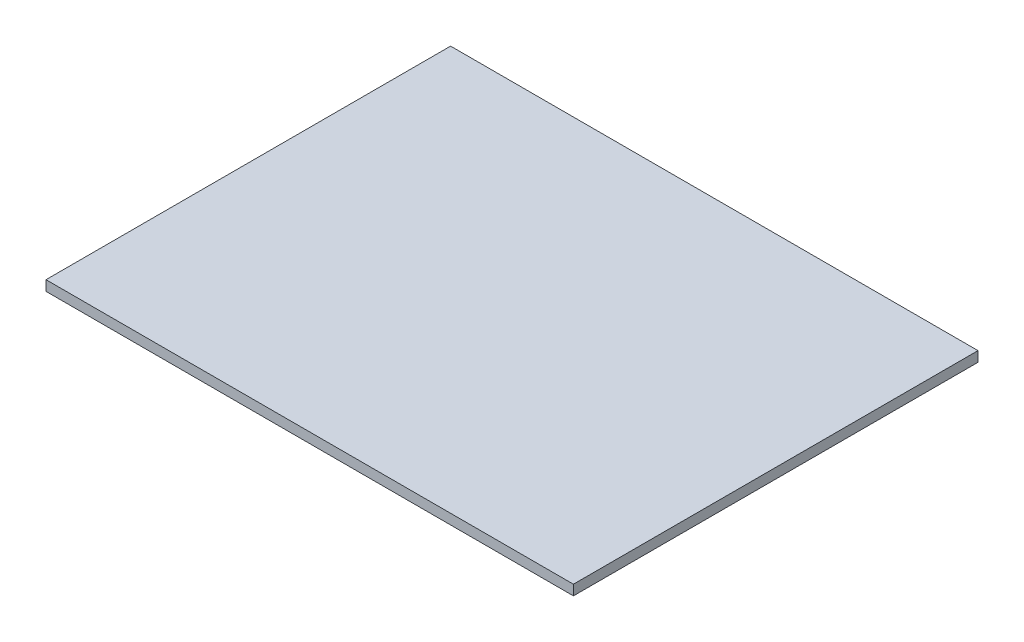
ISO-10303-21;
HEADER;
FILE_DESCRIPTION(('STEP AP214'),'2;1');
FILE_NAME('part.step','',(''),(''),'','','');
FILE_SCHEMA(('AUTOMOTIVE_DESIGN { 1 0 10303 214 1 1 1 1 }'));
ENDSEC;
DATA;
#1=APPLICATION_CONTEXT('core data for automotive mechanical design processes');
#2=APPLICATION_PROTOCOL_DEFINITION('international standard','automotive_design',2000,#1);
#3=PRODUCT_CONTEXT('',#1,'mechanical');
#4=PRODUCT('Part','Part','',(#3));
#5=PRODUCT_RELATED_PRODUCT_CATEGORY('part','',(#4));
#6=PRODUCT_DEFINITION_FORMATION('','',#4);
#7=PRODUCT_DEFINITION_CONTEXT('part definition',#1,'design');
#8=PRODUCT_DEFINITION('design','',#6,#7);
#9=PRODUCT_DEFINITION_SHAPE('','',#8);
#10=(LENGTH_UNIT() NAMED_UNIT(*) SI_UNIT(.MILLI.,.METRE.));
#11=(NAMED_UNIT(*) PLANE_ANGLE_UNIT() SI_UNIT($,.RADIAN.));
#12=(NAMED_UNIT(*) SI_UNIT($,.STERADIAN.) SOLID_ANGLE_UNIT());
#13=UNCERTAINTY_MEASURE_WITH_UNIT(LENGTH_MEASURE(1.E-05),#10,'distance_accuracy_value','');
#14=(GEOMETRIC_REPRESENTATION_CONTEXT(3) GLOBAL_UNCERTAINTY_ASSIGNED_CONTEXT((#13)) GLOBAL_UNIT_ASSIGNED_CONTEXT((#10,
#11,#12)) REPRESENTATION_CONTEXT('',''));
#15=CARTESIAN_POINT('',(0.,0.,0.));
#16=DIRECTION('',(0.,0.,1.));
#17=DIRECTION('',(1.,0.,0.));
#18=AXIS2_PLACEMENT_3D('',#15,#16,#17);
#19=CARTESIAN_POINT('',(-799.128065395095,18.,-494.779291553133));
#20=DIRECTION('',(1.,0.,0.));
#21=DIRECTION('',(0.,0.,-1.));
#22=AXIS2_PLACEMENT_3D('',#19,#20,#21);
#23=PLANE('',#22);
#24=DIRECTION('',(0.,0.,1.));
#25=VECTOR('',#24,1.);
#26=CARTESIAN_POINT('',(-799.128065395095,0.,-494.779291553133));
#27=LINE('',#26,#25);
#28=CARTESIAN_POINT('',(-799.128065395095,0.,-494.779291553133));
#29=VERTEX_POINT('',#28);
#30=CARTESIAN_POINT('',(-799.128065395095,0.,223.220708446867));
#31=VERTEX_POINT('',#30);
#32=EDGE_CURVE('E98',#29,#31,#27,.T.);
#33=ORIENTED_EDGE('',*,*,#32,.T.);
#34=DIRECTION('',(0.,-1.,0.));
#35=VECTOR('',#34,1.);
#36=CARTESIAN_POINT('',(-799.128065395095,18.,223.220708446867));
#37=LINE('',#36,#35);
#38=CARTESIAN_POINT('',(-799.128065395095,18.,223.220708446867));
#39=VERTEX_POINT('',#38);
#40=EDGE_CURVE('E11',#39,#31,#37,.T.);
#41=ORIENTED_EDGE('',*,*,#40,.F.);
#42=DIRECTION('',(0.,0.,1.));
#43=VECTOR('',#42,1.);
#44=CARTESIAN_POINT('',(-799.128065395095,18.,-494.779291553133));
#45=LINE('',#44,#43);
#46=CARTESIAN_POINT('',(-799.128065395095,18.,-494.779291553133));
#47=VERTEX_POINT('',#46);
#48=EDGE_CURVE('E86',#47,#39,#45,.T.);
#49=ORIENTED_EDGE('',*,*,#48,.F.);
#50=DIRECTION('',(0.,-1.,0.));
#51=VECTOR('',#50,1.);
#52=CARTESIAN_POINT('',(-799.128065395095,18.,-494.779291553133));
#53=LINE('',#52,#51);
#54=EDGE_CURVE('E94',#47,#29,#53,.T.);
#55=ORIENTED_EDGE('',*,*,#54,.T.);
#56=EDGE_LOOP('',(#33,#41,#49,#55));
#57=FACE_BOUND('',#56,.T.);
#58=ADVANCED_FACE('F35',(#57),#23,.F.);
#59=CARTESIAN_POINT('',(-799.128065395095,18.,223.220708446867));
#60=DIRECTION('',(0.,0.,-1.));
#61=DIRECTION('',(-1.,0.,0.));
#62=AXIS2_PLACEMENT_3D('',#59,#60,#61);
#63=PLANE('',#62);
#64=DIRECTION('',(1.,0.,0.));
#65=VECTOR('',#64,1.);
#66=CARTESIAN_POINT('',(-799.128065395095,0.,223.220708446867));
#67=LINE('',#66,#65);
#68=CARTESIAN_POINT('',(136.871934604905,0.,223.220708446867));
#69=VERTEX_POINT('',#68);
#70=EDGE_CURVE('E90',#31,#69,#67,.T.);
#71=ORIENTED_EDGE('',*,*,#70,.T.);
#72=DIRECTION('',(0.,-1.,0.));
#73=VECTOR('',#72,1.);
#74=CARTESIAN_POINT('',(136.871934604905,18.,223.220708446867));
#75=LINE('',#74,#73);
#76=CARTESIAN_POINT('',(136.871934604905,18.,223.220708446867));
#77=VERTEX_POINT('',#76);
#78=EDGE_CURVE('E43',#77,#69,#75,.T.);
#79=ORIENTED_EDGE('',*,*,#78,.F.);
#80=DIRECTION('',(1.,0.,0.));
#81=VECTOR('',#80,1.);
#82=CARTESIAN_POINT('',(-799.128065395095,18.,223.220708446867));
#83=LINE('',#82,#81);
#84=EDGE_CURVE('E81',#39,#77,#83,.T.);
#85=ORIENTED_EDGE('',*,*,#84,.F.);
#86=ORIENTED_EDGE('',*,*,#40,.T.);
#87=EDGE_LOOP('',(#71,#79,#85,#86));
#88=FACE_BOUND('',#87,.T.);
#89=ADVANCED_FACE('F89',(#88),#63,.F.);
#90=CARTESIAN_POINT('',(136.871934604905,18.,-494.779291553133));
#91=DIRECTION('',(-1.,0.,0.));
#92=DIRECTION('',(0.,0.,1.));
#93=AXIS2_PLACEMENT_3D('',#90,#91,#92);
#94=PLANE('',#93);
#95=DIRECTION('',(0.,0.,-1.));
#96=VECTOR('',#95,1.);
#97=CARTESIAN_POINT('',(136.871934604905,0.,-494.779291553133));
#98=LINE('',#97,#96);
#99=CARTESIAN_POINT('',(136.871934604905,0.,-494.779291553133));
#100=VERTEX_POINT('',#99);
#101=EDGE_CURVE('E68',#69,#100,#98,.T.);
#102=ORIENTED_EDGE('',*,*,#101,.T.);
#103=DIRECTION('',(0.,-1.,0.));
#104=VECTOR('',#103,1.);
#105=CARTESIAN_POINT('',(136.871934604905,18.,-494.779291553133));
#106=LINE('',#105,#104);
#107=CARTESIAN_POINT('',(136.871934604905,18.,-494.779291553133));
#108=VERTEX_POINT('',#107);
#109=EDGE_CURVE('E91',#108,#100,#106,.T.);
#110=ORIENTED_EDGE('',*,*,#109,.F.);
#111=DIRECTION('',(0.,0.,-1.));
#112=VECTOR('',#111,1.);
#113=CARTESIAN_POINT('',(136.871934604905,18.,-494.779291553133));
#114=LINE('',#113,#112);
#115=EDGE_CURVE('E84',#77,#108,#114,.T.);
#116=ORIENTED_EDGE('',*,*,#115,.F.);
#117=ORIENTED_EDGE('',*,*,#78,.T.);
#118=EDGE_LOOP('',(#102,#110,#116,#117));
#119=FACE_BOUND('',#118,.T.);
#120=ADVANCED_FACE('F92',(#119),#94,.F.);
#121=CARTESIAN_POINT('',(-799.128065395095,18.,-494.779291553133));
#122=DIRECTION('',(0.,0.,1.));
#123=DIRECTION('',(1.,0.,0.));
#124=AXIS2_PLACEMENT_3D('',#121,#122,#123);
#125=PLANE('',#124);
#126=DIRECTION('',(-1.,0.,0.));
#127=VECTOR('',#126,1.);
#128=CARTESIAN_POINT('',(-799.128065395095,0.,-494.779291553133));
#129=LINE('',#128,#127);
#130=EDGE_CURVE('E74',#100,#29,#129,.T.);
#131=ORIENTED_EDGE('',*,*,#130,.T.);
#132=ORIENTED_EDGE('',*,*,#54,.F.);
#133=DIRECTION('',(-1.,0.,0.));
#134=VECTOR('',#133,1.);
#135=CARTESIAN_POINT('',(-799.128065395095,18.,-494.779291553133));
#136=LINE('',#135,#134);
#137=EDGE_CURVE('E51',#108,#47,#136,.T.);
#138=ORIENTED_EDGE('',*,*,#137,.F.);
#139=ORIENTED_EDGE('',*,*,#109,.T.);
#140=EDGE_LOOP('',(#131,#132,#138,#139));
#141=FACE_BOUND('',#140,.T.);
#142=ADVANCED_FACE('F105',(#141),#125,.F.);
#143=CARTESIAN_POINT('',(0.,18.,0.));
#144=DIRECTION('',(0.,1.,0.));
#145=DIRECTION('',(0.,0.,1.));
#146=AXIS2_PLACEMENT_3D('',#143,#144,#145);
#147=PLANE('',#146);
#148=ORIENTED_EDGE('',*,*,#48,.T.);
#149=ORIENTED_EDGE('',*,*,#84,.T.);
#150=ORIENTED_EDGE('',*,*,#115,.T.);
#151=ORIENTED_EDGE('',*,*,#137,.T.);
#152=EDGE_LOOP('',(#148,#149,#150,#151));
#153=FACE_BOUND('',#152,.T.);
#154=ADVANCED_FACE('F82',(#153),#147,.T.);
#155=CARTESIAN_POINT('',(0.,0.,0.));
#156=DIRECTION('',(0.,1.,0.));
#157=DIRECTION('',(0.,0.,1.));
#158=AXIS2_PLACEMENT_3D('',#155,#156,#157);
#159=PLANE('',#158);
#160=ORIENTED_EDGE('',*,*,#32,.F.);
#161=ORIENTED_EDGE('',*,*,#130,.F.);
#162=ORIENTED_EDGE('',*,*,#101,.F.);
#163=ORIENTED_EDGE('',*,*,#70,.F.);
#164=EDGE_LOOP('',(#160,#161,#162,#163));
#165=FACE_BOUND('',#164,.T.);
#166=ADVANCED_FACE('F108',(#165),#159,.F.);
#167=CLOSED_SHELL('',(#58,#89,#120,#142,#154,#166));
#168=MANIFOLD_SOLID_BREP('B2',#167);
#169=ADVANCED_BREP_SHAPE_REPRESENTATION('',(#18,#168),#14);
#170=SHAPE_DEFINITION_REPRESENTATION(#9,#169);
ENDSEC;
END-ISO-10303-21;
